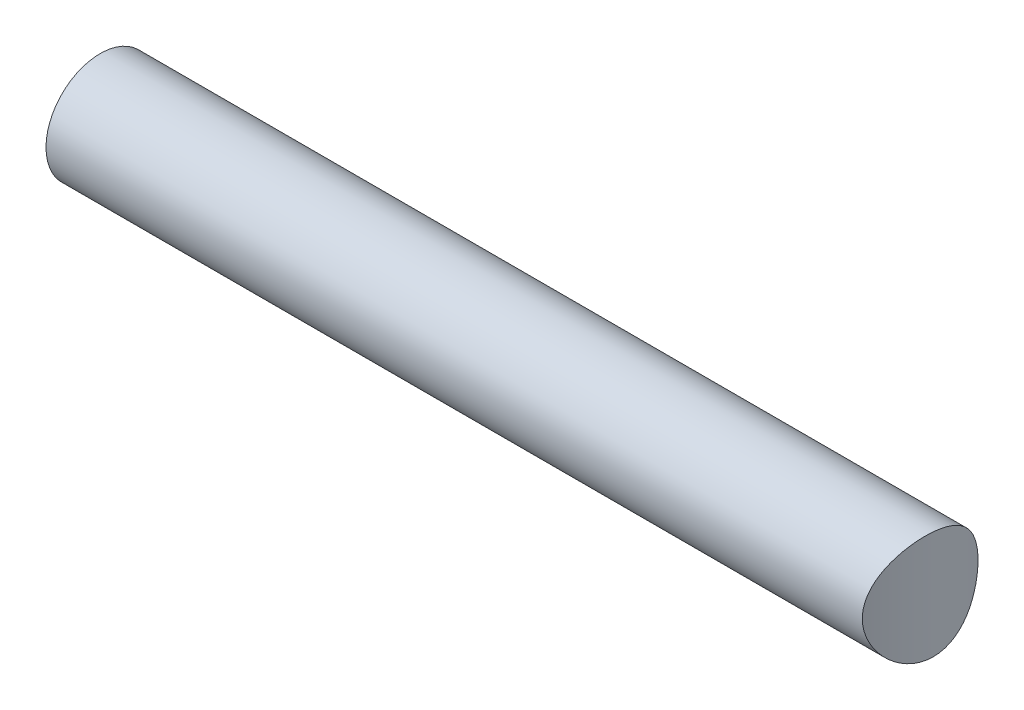
ISO-10303-21;
HEADER;
FILE_DESCRIPTION(('STEP AP214'),'2;1');
FILE_NAME('part.step','',(''),(''),'','','');
FILE_SCHEMA(('AUTOMOTIVE_DESIGN { 1 0 10303 214 1 1 1 1 }'));
ENDSEC;
DATA;
#1=APPLICATION_CONTEXT('core data for automotive mechanical design processes');
#2=APPLICATION_PROTOCOL_DEFINITION('international standard','automotive_design',2000,#1);
#3=PRODUCT_CONTEXT('',#1,'mechanical');
#4=PRODUCT('Part','Part','',(#3));
#5=PRODUCT_RELATED_PRODUCT_CATEGORY('part','',(#4));
#6=PRODUCT_DEFINITION_FORMATION('','',#4);
#7=PRODUCT_DEFINITION_CONTEXT('part definition',#1,'design');
#8=PRODUCT_DEFINITION('design','',#6,#7);
#9=PRODUCT_DEFINITION_SHAPE('','',#8);
#10=(LENGTH_UNIT() NAMED_UNIT(*) SI_UNIT(.MILLI.,.METRE.));
#11=(NAMED_UNIT(*) PLANE_ANGLE_UNIT() SI_UNIT($,.RADIAN.));
#12=(NAMED_UNIT(*) SI_UNIT($,.STERADIAN.) SOLID_ANGLE_UNIT());
#13=UNCERTAINTY_MEASURE_WITH_UNIT(LENGTH_MEASURE(1.E-05),#10,'distance_accuracy_value','');
#14=(GEOMETRIC_REPRESENTATION_CONTEXT(3) GLOBAL_UNCERTAINTY_ASSIGNED_CONTEXT((#13)) GLOBAL_UNIT_ASSIGNED_CONTEXT((#10,
#11,#12)) REPRESENTATION_CONTEXT('',''));
#15=CARTESIAN_POINT('',(0.,0.,0.));
#16=DIRECTION('',(0.,0.,1.));
#17=DIRECTION('',(1.,0.,0.));
#18=AXIS2_PLACEMENT_3D('',#15,#16,#17);
#19=CARTESIAN_POINT('',(75.6047371478238,94.13875,0.984250000000012));
#20=DIRECTION('',(-1.,0.,0.));
#21=DIRECTION('',(0.,0.,1.));
#22=AXIS2_PLACEMENT_3D('',#19,#20,#21);
#23=CYLINDRICAL_SURFACE('',#22,0.952500000000003);
#24=CARTESIAN_POINT('',(-14.8849303070355,94.13875,1.93675000000002));
#25=CARTESIAN_POINT('',(-14.884932596584,94.0882339288267,1.93675233580458));
#26=CARTESIAN_POINT('',(-14.882954772918,94.0377318950094,1.93271612017124));
#27=CARTESIAN_POINT('',(-14.8753027803101,93.9382792316821,1.9167754957869));
#28=CARTESIAN_POINT('',(-14.8696283389297,93.889328716797,1.90487050711082));
#29=CARTESIAN_POINT('',(-14.8552787925289,93.7944770910981,1.87375441025616));
#30=CARTESIAN_POINT('',(-14.8466133317578,93.7485667378435,1.85456676472093));
#31=CARTESIAN_POINT('',(-14.8271780010163,93.6606265051083,1.80953589419181));
#32=CARTESIAN_POINT('',(-14.8164074520272,93.6185978841802,1.78369052081927));
#33=CARTESIAN_POINT('',(-14.7930524255184,93.5368258515275,1.72428294565241));
#34=CARTESIAN_POINT('',(-14.7803978175428,93.497371824564,1.69035016805083));
#35=CARTESIAN_POINT('',(-14.7549518683428,93.4245064963758,1.61654994559468));
#36=CARTESIAN_POINT('',(-14.7421604807509,93.3910973178354,1.57668042494242));
#37=CARTESIAN_POINT('',(-14.7167611351346,93.3292750692484,1.48926580510166));
#38=CARTESIAN_POINT('',(-14.7042108903591,93.3012854845891,1.44140260253399));
#39=CARTESIAN_POINT('',(-14.6812984367006,93.2538887753806,1.34111155378842));
#40=CARTESIAN_POINT('',(-14.6709356497365,93.2344793818507,1.28868491877774));
#41=CARTESIAN_POINT('',(-14.6536379806118,93.2055992027986,1.18271842238521));
#42=CARTESIAN_POINT('',(-14.6465917518543,93.1957914081245,1.12928910184443));
#43=CARTESIAN_POINT('',(-14.6359152164426,93.1854225551727,1.02121164049112));
#44=CARTESIAN_POINT('',(-14.6322833124946,93.1848571710676,0.966564081857867));
#45=CARTESIAN_POINT('',(-14.6286897049742,93.1928287455388,0.861423217993201));
#46=CARTESIAN_POINT('',(-14.6285038646276,93.2007738465265,0.810891624291589));
#47=CARTESIAN_POINT('',(-14.6310063685449,93.2246194980858,0.711821501650787));
#48=CARTESIAN_POINT('',(-14.6336946538989,93.2405198855969,0.66328293188242));
#49=CARTESIAN_POINT('',(-14.6414122436707,93.2796419341951,0.569834440508218));
#50=CARTESIAN_POINT('',(-14.6464264649559,93.3028161179497,0.524903295723918));
#51=CARTESIAN_POINT('',(-14.6580889182502,93.35584659335,0.439410051596648));
#52=CARTESIAN_POINT('',(-14.6647375492542,93.3857045164823,0.398849022576634));
#53=CARTESIAN_POINT('',(-14.6791845119649,93.4529144771445,0.321191056657491));
#54=CARTESIAN_POINT('',(-14.6870226070514,93.490556501434,0.284352360892839));
#55=CARTESIAN_POINT('',(-14.7025835788176,93.5714071539145,0.21734963144083));
#56=CARTESIAN_POINT('',(-14.7103064269937,93.614617134556,0.187187224270192));
#57=CARTESIAN_POINT('',(-14.7248542965685,93.7069287988432,0.133532688855231));
#58=CARTESIAN_POINT('',(-14.7316455484194,93.7561680634398,0.110267093483));
#59=CARTESIAN_POINT('',(-14.743073716789,93.8581084965869,0.0724110592744395));
#60=CARTESIAN_POINT('',(-14.7477113292376,93.9108085405246,0.057817817615043));
#61=CARTESIAN_POINT('',(-14.7540289786929,94.0163545088009,0.0381725886573366));
#62=CARTESIAN_POINT('',(-14.755800283236,94.0691399673341,0.032825779732778));
#63=CARTESIAN_POINT('',(-14.7564108392787,94.1748772879383,0.0309684933241144));
#64=CARTESIAN_POINT('',(-14.7552506734505,94.2278291148518,0.0344562598405303));
#65=CARTESIAN_POINT('',(-14.7502632848364,94.3304350456841,0.0498463421927394));
#66=CARTESIAN_POINT('',(-14.7465316208155,94.3801395819276,0.0614473855380011));
#67=CARTESIAN_POINT('',(-14.7370037611075,94.4768861458352,0.0923419126579698));
#68=CARTESIAN_POINT('',(-14.7312072094085,94.523927712749,0.111636723000651));
#69=CARTESIAN_POINT('',(-14.7181161270818,94.6153758574567,0.15794557703312));
#70=CARTESIAN_POINT('',(-14.7107866478835,94.6596824665806,0.185146826227401));
#71=CARTESIAN_POINT('',(-14.6956559560554,94.7432504948451,0.246334745115478));
#72=CARTESIAN_POINT('',(-14.6878546138868,94.7825105192354,0.280323284047805));
#73=CARTESIAN_POINT('',(-14.6724377305193,94.856558630357,0.355825782699108));
#74=CARTESIAN_POINT('',(-14.664843427212,94.8910926696129,0.39759402505123));
#75=CARTESIAN_POINT('',(-14.6512594111391,94.9526829910204,0.486560294268062));
#76=CARTESIAN_POINT('',(-14.6452695057357,94.9797401709206,0.533757668290787));
#77=CARTESIAN_POINT('',(-14.6358958495385,95.0251407472903,0.631510778243044));
#78=CARTESIAN_POINT('',(-14.6324724287347,95.0436150282475,0.682001693605253));
#79=CARTESIAN_POINT('',(-14.6287338745036,95.0718184569847,0.785473850081463));
#80=CARTESIAN_POINT('',(-14.6284175101108,95.0815510666848,0.838454096603118));
#81=CARTESIAN_POINT('',(-14.6311342578632,95.0916958633992,0.94249378512732));
#82=CARTESIAN_POINT('',(-14.6339985553702,95.092555099411,0.993514624858792));
#83=CARTESIAN_POINT('',(-14.6427479515765,95.0861746733532,1.09477832657302));
#84=CARTESIAN_POINT('',(-14.6486329928772,95.0789351651688,1.14502120331955));
#85=CARTESIAN_POINT('',(-14.6630167214117,95.0567806807247,1.24307257235289));
#86=CARTESIAN_POINT('',(-14.6715003549906,95.0419095875933,1.29089328369469));
#87=CARTESIAN_POINT('',(-14.6904963538305,95.0050676040805,1.38328048590655));
#88=CARTESIAN_POINT('',(-14.7010092251718,94.9830949416843,1.42784616115945));
#89=CARTESIAN_POINT('',(-14.7239477930208,94.9312339767593,1.51524306185965));
#90=CARTESIAN_POINT('',(-14.7364486744769,94.9009635111122,1.55782764250749));
#91=CARTESIAN_POINT('',(-14.7618514312698,94.8339525531885,1.63744186212156));
#92=CARTESIAN_POINT('',(-14.7747534895254,94.7972090727951,1.6744689209036));
#93=CARTESIAN_POINT('',(-14.8005364857655,94.7158245847146,1.74402755375153));
#94=CARTESIAN_POINT('',(-14.8133765821783,94.670858633194,1.77619600326325));
#95=CARTESIAN_POINT('',(-14.836875747256,94.5756017307998,1.83246887056852));
#96=CARTESIAN_POINT('',(-14.8475350042785,94.5253112403727,1.85657398490098));
#97=CARTESIAN_POINT('',(-14.8654425326332,94.4201187681282,1.8959929516616));
#98=CARTESIAN_POINT('',(-14.8726508055398,94.3651710094,1.91120414656736));
#99=CARTESIAN_POINT('',(-14.8823912328143,94.2530581104654,1.93157669662464));
#100=CARTESIAN_POINT('',(-14.8849277170395,94.1958950736313,1.93674735767806));
#101=CARTESIAN_POINT('',(-14.8849303070355,94.13875,1.93675000000002));
#102=B_SPLINE_CURVE_WITH_KNOTS('',3,(#24,#25,#26,#27,#28,#29,#30,#31,#32,#33,#34,#35,#36,#37,
#38,#39,#40,#41,#42,#43,#44,#45,#46,#47,#48,#49,#50,#51,#52,#53,#54,#55,#56,#57,#58,#59,#60,#61,
#62,#63,#64,#65,#66,#67,#68,#69,#70,#71,#72,#73,#74,#75,#76,#77,#78,#79,#80,#81,#82,#83,#84,#85,
#86,#87,#88,#89,#90,#91,#92,#93,#94,#95,#96,#97,#98,#99,#100,#101),.UNSPECIFIED.,.T.,.F.,(4,2,2,
2,2,2,2,2,2,2,2,2,2,2,2,2,2,2,2,2,2,2,2,2,2,2,2,2,2,2,2,2,2,2,2,2,2,2,4),(0.,0.151331035773662,
0.302673225821272,0.45353191723866,0.604439350281621,0.764421170889484,0.924459061484175,
1.09416037716772,1.26381678945916,1.42727859002716,1.59066388157272,1.74338218636226,
1.89609736099533,2.04783576935943,2.19961125721526,2.35864124270947,2.51770992948471,
2.68153713578973,2.84531136584838,3.00376017024574,3.16217748312595,3.31500462517939,
3.46785812926292,3.62467555554303,3.78153622948992,3.9449237879801,4.10829171994816,
4.26907924382301,4.42980306371271,4.58238742073275,4.73496887852783,4.88668263308202,
5.03843427318484,5.1989020864904,5.359444171076,5.5288883653243,5.69831791861208,
5.86966634986564,6.04085589373036),.UNSPECIFIED.);
#103=CARTESIAN_POINT('',(-14.8849303070355,94.13875,1.93675000000002));
#104=VERTEX_POINT('',#103);
#105=EDGE_CURVE('E10',#104,#104,#102,.T.);
#106=ORIENTED_EDGE('',*,*,#105,.F.);
#107=EDGE_LOOP('',(#106));
#108=FACE_BOUND('',#107,.T.);
#109=CARTESIAN_POINT('',(-29.2339450700131,94.13875,0.984250000000012));
#110=DIRECTION('',(-1.,0.,0.));
#111=DIRECTION('',(0.,-1.,0.));
#112=AXIS2_PLACEMENT_3D('',#109,#110,#111);
#113=CIRCLE('',#112,0.952500000000003);
#114=CARTESIAN_POINT('',(-29.2339450700131,93.18625,0.984250000000012));
#115=VERTEX_POINT('',#114);
#116=EDGE_CURVE('E48',#115,#115,#113,.F.);
#117=ORIENTED_EDGE('',*,*,#116,.T.);
#118=EDGE_LOOP('',(#117));
#119=FACE_BOUND('',#118,.T.);
#120=ADVANCED_FACE('F37',(#108,#119),#23,.T.);
#121=CARTESIAN_POINT('',(-17.1689450700131,96.52,0.8255));
#122=DIRECTION('',(0.,-1.,0.));
#123=DIRECTION('',(0.,0.,-1.));
#124=AXIS2_PLACEMENT_3D('',#121,#122,#123);
#125=CYLINDRICAL_SURFACE('',#124,2.54);
#126=ORIENTED_EDGE('',*,*,#105,.T.);
#127=EDGE_LOOP('',(#126));
#128=FACE_BOUND('',#127,.T.);
#129=ADVANCED_FACE('F39',(#128),#125,.T.);
#130=CARTESIAN_POINT('',(-29.2339450700131,0.,-6.477));
#131=DIRECTION('',(-1.,0.,0.));
#132=DIRECTION('',(0.,-1.,0.));
#133=AXIS2_PLACEMENT_3D('',#130,#131,#132);
#134=PLANE('',#133);
#135=ORIENTED_EDGE('',*,*,#116,.F.);
#136=EDGE_LOOP('',(#135));
#137=FACE_BOUND('',#136,.T.);
#138=ADVANCED_FACE('F55',(#137),#134,.T.);
#139=CLOSED_SHELL('',(#120,#129,#138));
#140=MANIFOLD_SOLID_BREP('B2',#139);
#141=ADVANCED_BREP_SHAPE_REPRESENTATION('',(#18,#140),#14);
#142=SHAPE_DEFINITION_REPRESENTATION(#9,#141);
ENDSEC;
END-ISO-10303-21;
